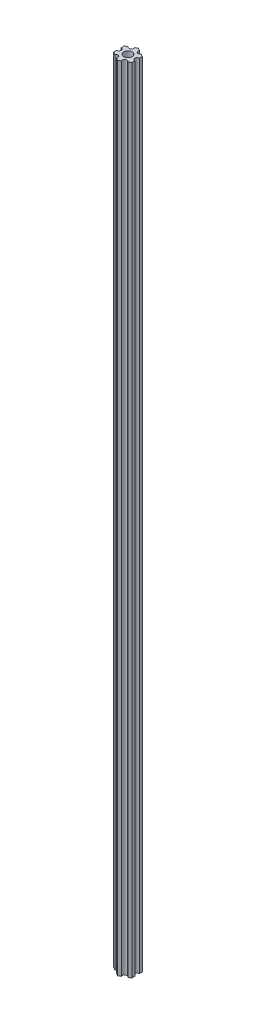
ISO-10303-21;
HEADER;
FILE_DESCRIPTION(('STEP AP214'),'2;1');
FILE_NAME('part.step','',(''),(''),'','','');
FILE_SCHEMA(('AUTOMOTIVE_DESIGN { 1 0 10303 214 1 1 1 1 }'));
ENDSEC;
DATA;
#1=APPLICATION_CONTEXT('core data for automotive mechanical design processes');
#2=APPLICATION_PROTOCOL_DEFINITION('international standard','automotive_design',2000,#1);
#3=PRODUCT_CONTEXT('',#1,'mechanical');
#4=PRODUCT('Part','Part','',(#3));
#5=PRODUCT_RELATED_PRODUCT_CATEGORY('part','',(#4));
#6=PRODUCT_DEFINITION_FORMATION('','',#4);
#7=PRODUCT_DEFINITION_CONTEXT('part definition',#1,'design');
#8=PRODUCT_DEFINITION('design','',#6,#7);
#9=PRODUCT_DEFINITION_SHAPE('','',#8);
#10=(LENGTH_UNIT() NAMED_UNIT(*) SI_UNIT(.MILLI.,.METRE.));
#11=(NAMED_UNIT(*) PLANE_ANGLE_UNIT() SI_UNIT($,.RADIAN.));
#12=(NAMED_UNIT(*) SI_UNIT($,.STERADIAN.) SOLID_ANGLE_UNIT());
#13=UNCERTAINTY_MEASURE_WITH_UNIT(LENGTH_MEASURE(1.E-05),#10,'distance_accuracy_value','');
#14=(GEOMETRIC_REPRESENTATION_CONTEXT(3) GLOBAL_UNCERTAINTY_ASSIGNED_CONTEXT((#13)) GLOBAL_UNIT_ASSIGNED_CONTEXT((#10,
#11,#12)) REPRESENTATION_CONTEXT('',''));
#15=CARTESIAN_POINT('',(0.,0.,0.));
#16=DIRECTION('',(0.,0.,1.));
#17=DIRECTION('',(1.,0.,0.));
#18=AXIS2_PLACEMENT_3D('',#15,#16,#17);
#19=CARTESIAN_POINT('',(3.175,-555.625,5.49926131403119));
#20=DIRECTION('',(0.,1.,0.));
#21=DIRECTION('',(-0.866025403784439,0.,0.5));
#22=AXIS2_PLACEMENT_3D('',#19,#20,#21);
#23=CYLINDRICAL_SURFACE('',#22,1.5875);
#24=DIRECTION('',(0.,-1.,0.));
#25=VECTOR('',#24,1.);
#26=CARTESIAN_POINT('',(1.8001846714922,-555.625,6.29301131403118));
#27=LINE('',#26,#25);
#28=CARTESIAN_POINT('',(1.8001846714922,0.,6.29301131403119));
#29=VERTEX_POINT('',#28);
#30=CARTESIAN_POINT('',(1.8001846714922,-555.625,6.29301131403119));
#31=VERTEX_POINT('',#30);
#32=EDGE_CURVE('E491',#29,#31,#27,.T.);
#33=ORIENTED_EDGE('',*,*,#32,.T.);
#34=CARTESIAN_POINT('',(3.175,-555.625,5.49926131403119));
#35=DIRECTION('',(0.,-1.,0.));
#36=DIRECTION('',(0.866025403784439,0.,-0.5));
#37=AXIS2_PLACEMENT_3D('',#34,#35,#36);
#38=CIRCLE('',#37,1.5875);
#39=CARTESIAN_POINT('',(4.5498153285078,-555.625,4.70551131403118));
#40=VERTEX_POINT('',#39);
#41=EDGE_CURVE('E307',#31,#40,#38,.T.);
#42=ORIENTED_EDGE('',*,*,#41,.T.);
#43=DIRECTION('',(0.,1.,0.));
#44=VECTOR('',#43,1.);
#45=CARTESIAN_POINT('',(4.5498153285078,-555.625,4.70551131403118));
#46=LINE('',#45,#44);
#47=CARTESIAN_POINT('',(4.5498153285078,0.,4.70551131403119));
#48=VERTEX_POINT('',#47);
#49=EDGE_CURVE('E349',#40,#48,#46,.T.);
#50=ORIENTED_EDGE('',*,*,#49,.T.);
#51=CARTESIAN_POINT('',(3.175,0.,5.49926131403119));
#52=DIRECTION('',(0.,-1.,0.));
#53=DIRECTION('',(0.866025403784439,0.,-0.5));
#54=AXIS2_PLACEMENT_3D('',#51,#52,#53);
#55=CIRCLE('',#54,1.5875);
#56=EDGE_CURVE('E318',#29,#48,#55,.T.);
#57=ORIENTED_EDGE('',*,*,#56,.F.);
#58=EDGE_LOOP('',(#33,#42,#50,#57));
#59=FACE_BOUND('',#58,.T.);
#60=ADVANCED_FACE('F17',(#59),#23,.F.);
#61=CARTESIAN_POINT('',(-3.175,-555.625,5.49926131403119));
#62=DIRECTION('',(0.,1.,0.));
#63=DIRECTION('',(-0.866025403784439,0.,-0.5));
#64=AXIS2_PLACEMENT_3D('',#61,#62,#63);
#65=CYLINDRICAL_SURFACE('',#64,1.5875);
#66=DIRECTION('',(0.,-1.,0.));
#67=VECTOR('',#66,1.);
#68=CARTESIAN_POINT('',(-4.5498153285078,-555.625,4.70551131403119));
#69=LINE('',#68,#67);
#70=CARTESIAN_POINT('',(-4.5498153285078,0.,4.70551131403119));
#71=VERTEX_POINT('',#70);
#72=CARTESIAN_POINT('',(-4.5498153285078,-555.625,4.70551131403119));
#73=VERTEX_POINT('',#72);
#74=EDGE_CURVE('E352',#71,#73,#69,.T.);
#75=ORIENTED_EDGE('',*,*,#74,.T.);
#76=CARTESIAN_POINT('',(-3.175,-555.625,5.49926131403119));
#77=DIRECTION('',(0.,-1.,0.));
#78=DIRECTION('',(0.866025403784439,0.,0.5));
#79=AXIS2_PLACEMENT_3D('',#76,#77,#78);
#80=CIRCLE('',#79,1.5875);
#81=CARTESIAN_POINT('',(-1.8001846714922,-555.625,6.29301131403119));
#82=VERTEX_POINT('',#81);
#83=EDGE_CURVE('E308',#73,#82,#80,.T.);
#84=ORIENTED_EDGE('',*,*,#83,.T.);
#85=DIRECTION('',(0.,1.,0.));
#86=VECTOR('',#85,1.);
#87=CARTESIAN_POINT('',(-1.8001846714922,-555.625,6.29301131403119));
#88=LINE('',#87,#86);
#89=CARTESIAN_POINT('',(-1.8001846714922,0.,6.29301131403119));
#90=VERTEX_POINT('',#89);
#91=EDGE_CURVE('E363',#82,#90,#88,.T.);
#92=ORIENTED_EDGE('',*,*,#91,.T.);
#93=CARTESIAN_POINT('',(-3.175,0.,5.49926131403119));
#94=DIRECTION('',(0.,-1.,0.));
#95=DIRECTION('',(0.866025403784439,0.,0.5));
#96=AXIS2_PLACEMENT_3D('',#93,#94,#95);
#97=CIRCLE('',#96,1.5875);
#98=EDGE_CURVE('E11',#71,#90,#97,.T.);
#99=ORIENTED_EDGE('',*,*,#98,.F.);
#100=EDGE_LOOP('',(#75,#84,#92,#99));
#101=FACE_BOUND('',#100,.T.);
#102=ADVANCED_FACE('F19',(#101),#65,.F.);
#103=CARTESIAN_POINT('',(-6.35,-555.625,0.));
#104=DIRECTION('',(0.,1.,0.));
#105=DIRECTION('',(0.,0.,-1.));
#106=AXIS2_PLACEMENT_3D('',#103,#104,#105);
#107=CYLINDRICAL_SURFACE('',#106,1.5875);
#108=DIRECTION('',(0.,-1.,0.));
#109=VECTOR('',#108,1.);
#110=CARTESIAN_POINT('',(-6.35,-555.625,-1.5875));
#111=LINE('',#110,#109);
#112=CARTESIAN_POINT('',(-6.35,0.,-1.5875));
#113=VERTEX_POINT('',#112);
#114=CARTESIAN_POINT('',(-6.35,-555.625,-1.5875));
#115=VERTEX_POINT('',#114);
#116=EDGE_CURVE('E375',#113,#115,#111,.T.);
#117=ORIENTED_EDGE('',*,*,#116,.T.);
#118=CARTESIAN_POINT('',(-6.35,-555.625,0.));
#119=DIRECTION('',(0.,-1.,0.));
#120=DIRECTION('',(0.,0.,1.));
#121=AXIS2_PLACEMENT_3D('',#118,#119,#120);
#122=CIRCLE('',#121,1.5875);
#123=CARTESIAN_POINT('',(-6.35,-555.625,1.5875));
#124=VERTEX_POINT('',#123);
#125=EDGE_CURVE('E216',#115,#124,#122,.T.);
#126=ORIENTED_EDGE('',*,*,#125,.T.);
#127=DIRECTION('',(0.,1.,0.));
#128=VECTOR('',#127,1.);
#129=CARTESIAN_POINT('',(-6.35,-555.625,1.5875));
#130=LINE('',#129,#128);
#131=CARTESIAN_POINT('',(-6.35,0.,1.5875));
#132=VERTEX_POINT('',#131);
#133=EDGE_CURVE('E207',#124,#132,#130,.T.);
#134=ORIENTED_EDGE('',*,*,#133,.T.);
#135=CARTESIAN_POINT('',(-6.35,0.,0.));
#136=DIRECTION('',(0.,-1.,0.));
#137=DIRECTION('',(0.,0.,1.));
#138=AXIS2_PLACEMENT_3D('',#135,#136,#137);
#139=CIRCLE('',#138,1.5875);
#140=EDGE_CURVE('E21',#113,#132,#139,.T.);
#141=ORIENTED_EDGE('',*,*,#140,.F.);
#142=EDGE_LOOP('',(#117,#126,#134,#141));
#143=FACE_BOUND('',#142,.T.);
#144=ADVANCED_FACE('F215',(#143),#107,.F.);
#145=CARTESIAN_POINT('',(-3.175,-555.625,-5.49926131403118));
#146=DIRECTION('',(0.,1.,0.));
#147=DIRECTION('',(0.866025403784439,0.,-0.5));
#148=AXIS2_PLACEMENT_3D('',#145,#146,#147);
#149=CYLINDRICAL_SURFACE('',#148,1.5875);
#150=DIRECTION('',(0.,-1.,0.));
#151=VECTOR('',#150,1.);
#152=CARTESIAN_POINT('',(-1.8001846714922,-555.625,-6.29301131403118));
#153=LINE('',#152,#151);
#154=CARTESIAN_POINT('',(-1.8001846714922,0.,-6.29301131403118));
#155=VERTEX_POINT('',#154);
#156=CARTESIAN_POINT('',(-1.8001846714922,-555.625,-6.29301131403118));
#157=VERTEX_POINT('',#156);
#158=EDGE_CURVE('E212',#155,#157,#153,.T.);
#159=ORIENTED_EDGE('',*,*,#158,.T.);
#160=CARTESIAN_POINT('',(-3.175,-555.625,-5.49926131403118));
#161=DIRECTION('',(0.,-1.,0.));
#162=DIRECTION('',(-0.866025403784439,0.,0.5));
#163=AXIS2_PLACEMENT_3D('',#160,#161,#162);
#164=CIRCLE('',#163,1.5875);
#165=CARTESIAN_POINT('',(-4.5498153285078,-555.625,-4.70551131403118));
#166=VERTEX_POINT('',#165);
#167=EDGE_CURVE('E288',#157,#166,#164,.T.);
#168=ORIENTED_EDGE('',*,*,#167,.T.);
#169=DIRECTION('',(0.,1.,0.));
#170=VECTOR('',#169,1.);
#171=CARTESIAN_POINT('',(-4.5498153285078,-555.625,-4.70551131403118));
#172=LINE('',#171,#170);
#173=CARTESIAN_POINT('',(-4.5498153285078,0.,-4.70551131403118));
#174=VERTEX_POINT('',#173);
#175=EDGE_CURVE('E257',#166,#174,#172,.T.);
#176=ORIENTED_EDGE('',*,*,#175,.T.);
#177=CARTESIAN_POINT('',(-3.175,0.,-5.49926131403118));
#178=DIRECTION('',(0.,-1.,0.));
#179=DIRECTION('',(-0.866025403784439,0.,0.5));
#180=AXIS2_PLACEMENT_3D('',#177,#178,#179);
#181=CIRCLE('',#180,1.5875);
#182=EDGE_CURVE('E203',#155,#174,#181,.T.);
#183=ORIENTED_EDGE('',*,*,#182,.F.);
#184=EDGE_LOOP('',(#159,#168,#176,#183));
#185=FACE_BOUND('',#184,.T.);
#186=ADVANCED_FACE('F332',(#185),#149,.F.);
#187=CARTESIAN_POINT('',(3.175,-555.625,-5.49926131403119));
#188=DIRECTION('',(0.,1.,0.));
#189=DIRECTION('',(0.866025403784439,0.,0.5));
#190=AXIS2_PLACEMENT_3D('',#187,#188,#189);
#191=CYLINDRICAL_SURFACE('',#190,1.5875);
#192=DIRECTION('',(0.,-1.,0.));
#193=VECTOR('',#192,1.);
#194=CARTESIAN_POINT('',(4.5498153285078,-555.625,-4.70551131403119));
#195=LINE('',#194,#193);
#196=CARTESIAN_POINT('',(4.5498153285078,0.,-4.70551131403119));
#197=VERTEX_POINT('',#196);
#198=CARTESIAN_POINT('',(4.5498153285078,-555.625,-4.70551131403119));
#199=VERTEX_POINT('',#198);
#200=EDGE_CURVE('E230',#197,#199,#195,.T.);
#201=ORIENTED_EDGE('',*,*,#200,.T.);
#202=CARTESIAN_POINT('',(3.175,-555.625,-5.49926131403119));
#203=DIRECTION('',(0.,-1.,0.));
#204=DIRECTION('',(-0.866025403784439,0.,-0.5));
#205=AXIS2_PLACEMENT_3D('',#202,#203,#204);
#206=CIRCLE('',#205,1.5875);
#207=CARTESIAN_POINT('',(1.8001846714922,-555.625,-6.29301131403119));
#208=VERTEX_POINT('',#207);
#209=EDGE_CURVE('E291',#199,#208,#206,.T.);
#210=ORIENTED_EDGE('',*,*,#209,.T.);
#211=DIRECTION('',(0.,1.,0.));
#212=VECTOR('',#211,1.);
#213=CARTESIAN_POINT('',(1.8001846714922,-555.625,-6.29301131403119));
#214=LINE('',#213,#212);
#215=CARTESIAN_POINT('',(1.8001846714922,0.,-6.29301131403119));
#216=VERTEX_POINT('',#215);
#217=EDGE_CURVE('E279',#208,#216,#214,.T.);
#218=ORIENTED_EDGE('',*,*,#217,.T.);
#219=CARTESIAN_POINT('',(3.175,0.,-5.49926131403119));
#220=DIRECTION('',(0.,-1.,0.));
#221=DIRECTION('',(-0.866025403784439,0.,-0.5));
#222=AXIS2_PLACEMENT_3D('',#219,#220,#221);
#223=CIRCLE('',#222,1.5875);
#224=EDGE_CURVE('E233',#197,#216,#223,.T.);
#225=ORIENTED_EDGE('',*,*,#224,.F.);
#226=EDGE_LOOP('',(#201,#210,#218,#225));
#227=FACE_BOUND('',#226,.T.);
#228=ADVANCED_FACE('F390',(#227),#191,.F.);
#229=CARTESIAN_POINT('',(6.35,-555.625,0.));
#230=DIRECTION('',(0.,1.,0.));
#231=DIRECTION('',(0.,0.,1.));
#232=AXIS2_PLACEMENT_3D('',#229,#230,#231);
#233=CYLINDRICAL_SURFACE('',#232,1.5875);
#234=DIRECTION('',(0.,-1.,0.));
#235=VECTOR('',#234,1.);
#236=CARTESIAN_POINT('',(6.35,-555.625,1.5875));
#237=LINE('',#236,#235);
#238=CARTESIAN_POINT('',(6.35,0.,1.5875));
#239=VERTEX_POINT('',#238);
#240=CARTESIAN_POINT('',(6.35,-555.625,1.5875));
#241=VERTEX_POINT('',#240);
#242=EDGE_CURVE('E295',#239,#241,#237,.T.);
#243=ORIENTED_EDGE('',*,*,#242,.T.);
#244=CARTESIAN_POINT('',(6.35,-555.625,0.));
#245=DIRECTION('',(0.,-1.,0.));
#246=DIRECTION('',(0.,0.,-1.));
#247=AXIS2_PLACEMENT_3D('',#244,#245,#246);
#248=CIRCLE('',#247,1.5875);
#249=CARTESIAN_POINT('',(6.35,-555.625,-1.5875));
#250=VERTEX_POINT('',#249);
#251=EDGE_CURVE('E313',#241,#250,#248,.T.);
#252=ORIENTED_EDGE('',*,*,#251,.T.);
#253=DIRECTION('',(0.,1.,0.));
#254=VECTOR('',#253,1.);
#255=CARTESIAN_POINT('',(6.35,-555.625,-1.5875));
#256=LINE('',#255,#254);
#257=CARTESIAN_POINT('',(6.35,0.,-1.5875));
#258=VERTEX_POINT('',#257);
#259=EDGE_CURVE('E248',#250,#258,#256,.T.);
#260=ORIENTED_EDGE('',*,*,#259,.T.);
#261=CARTESIAN_POINT('',(6.35,0.,0.));
#262=DIRECTION('',(0.,-1.,0.));
#263=DIRECTION('',(0.,0.,-1.));
#264=AXIS2_PLACEMENT_3D('',#261,#262,#263);
#265=CIRCLE('',#264,1.5875);
#266=EDGE_CURVE('E236',#239,#258,#265,.T.);
#267=ORIENTED_EDGE('',*,*,#266,.F.);
#268=EDGE_LOOP('',(#243,#252,#260,#267));
#269=FACE_BOUND('',#268,.T.);
#270=ADVANCED_FACE('F460',(#269),#233,.F.);
#271=CARTESIAN_POINT('',(0.,-555.625,0.));
#272=DIRECTION('',(0.,1.,0.));
#273=DIRECTION('',(0.,0.,1.));
#274=AXIS2_PLACEMENT_3D('',#271,#272,#273);
#275=CYLINDRICAL_SURFACE('',#274,2.9337);
#276=CARTESIAN_POINT('',(0.,0.,0.));
#277=DIRECTION('',(0.,-1.,0.));
#278=DIRECTION('',(0.,0.,-1.));
#279=AXIS2_PLACEMENT_3D('',#276,#277,#278);
#280=CIRCLE('',#279,2.9337);
#281=CARTESIAN_POINT('',(0.,0.,-2.9337));
#282=VERTEX_POINT('',#281);
#283=EDGE_CURVE('E37',#282,#282,#280,.T.);
#284=ORIENTED_EDGE('',*,*,#283,.F.);
#285=EDGE_LOOP('',(#284));
#286=FACE_BOUND('',#285,.T.);
#287=CARTESIAN_POINT('',(0.,-555.625,0.));
#288=DIRECTION('',(0.,-1.,0.));
#289=DIRECTION('',(0.,0.,-1.));
#290=AXIS2_PLACEMENT_3D('',#287,#288,#289);
#291=CIRCLE('',#290,2.9337);
#292=CARTESIAN_POINT('',(0.,-555.625,-2.9337));
#293=VERTEX_POINT('',#292);
#294=EDGE_CURVE('E44',#293,#293,#291,.T.);
#295=ORIENTED_EDGE('',*,*,#294,.T.);
#296=EDGE_LOOP('',(#295));
#297=FACE_BOUND('',#296,.T.);
#298=ADVANCED_FACE('F462',(#286,#297),#275,.F.);
#299=CARTESIAN_POINT('',(0.,0.,0.));
#300=DIRECTION('',(0.,-1.,0.));
#301=DIRECTION('',(0.,0.,-1.));
#302=AXIS2_PLACEMENT_3D('',#299,#300,#301);
#303=PLANE('',#302);
#304=DIRECTION('',(-0.866025403784439,0.,0.5));
#305=VECTOR('',#304,1.);
#306=CARTESIAN_POINT('',(3.175,0.,5.49926131403118));
#307=LINE('',#306,#305);
#308=CARTESIAN_POINT('',(0.,0.,7.33234841870825));
#309=VERTEX_POINT('',#308);
#310=EDGE_CURVE('E419',#29,#309,#307,.T.);
#311=ORIENTED_EDGE('',*,*,#310,.F.);
#312=ORIENTED_EDGE('',*,*,#56,.T.);
#313=DIRECTION('',(-0.866025403784439,0.,0.5));
#314=VECTOR('',#313,1.);
#315=CARTESIAN_POINT('',(3.175,0.,5.49926131403118));
#316=LINE('',#315,#314);
#317=CARTESIAN_POINT('',(6.35,0.,3.66617420935412));
#318=VERTEX_POINT('',#317);
#319=EDGE_CURVE('E356',#318,#48,#316,.T.);
#320=ORIENTED_EDGE('',*,*,#319,.F.);
#321=DIRECTION('',(0.,0.,1.));
#322=VECTOR('',#321,1.);
#323=CARTESIAN_POINT('',(6.35,0.,0.));
#324=LINE('',#323,#322);
#325=EDGE_CURVE('E249',#239,#318,#324,.T.);
#326=ORIENTED_EDGE('',*,*,#325,.F.);
#327=ORIENTED_EDGE('',*,*,#266,.T.);
#328=DIRECTION('',(0.,0.,1.));
#329=VECTOR('',#328,1.);
#330=CARTESIAN_POINT('',(6.35,0.,0.));
#331=LINE('',#330,#329);
#332=CARTESIAN_POINT('',(6.35,0.,-3.66617420935413));
#333=VERTEX_POINT('',#332);
#334=EDGE_CURVE('E304',#333,#258,#331,.T.);
#335=ORIENTED_EDGE('',*,*,#334,.F.);
#336=DIRECTION('',(0.866025403784439,0.,0.5));
#337=VECTOR('',#336,1.);
#338=CARTESIAN_POINT('',(3.175,0.,-5.49926131403119));
#339=LINE('',#338,#337);
#340=EDGE_CURVE('E270',#197,#333,#339,.T.);
#341=ORIENTED_EDGE('',*,*,#340,.F.);
#342=ORIENTED_EDGE('',*,*,#224,.T.);
#343=DIRECTION('',(0.866025403784439,0.,0.5));
#344=VECTOR('',#343,1.);
#345=CARTESIAN_POINT('',(3.175,0.,-5.49926131403119));
#346=LINE('',#345,#344);
#347=CARTESIAN_POINT('',(0.,0.,-7.33234841870825));
#348=VERTEX_POINT('',#347);
#349=EDGE_CURVE('E287',#348,#216,#346,.T.);
#350=ORIENTED_EDGE('',*,*,#349,.F.);
#351=DIRECTION('',(0.866025403784439,0.,-0.5));
#352=VECTOR('',#351,1.);
#353=CARTESIAN_POINT('',(-3.175,0.,-5.49926131403119));
#354=LINE('',#353,#352);
#355=EDGE_CURVE('E240',#155,#348,#354,.T.);
#356=ORIENTED_EDGE('',*,*,#355,.F.);
#357=ORIENTED_EDGE('',*,*,#182,.T.);
#358=DIRECTION('',(0.866025403784439,0.,-0.5));
#359=VECTOR('',#358,1.);
#360=CARTESIAN_POINT('',(-3.175,0.,-5.49926131403119));
#361=LINE('',#360,#359);
#362=CARTESIAN_POINT('',(-6.35,0.,-3.66617420935412));
#363=VERTEX_POINT('',#362);
#364=EDGE_CURVE('E262',#363,#174,#361,.T.);
#365=ORIENTED_EDGE('',*,*,#364,.F.);
#366=DIRECTION('',(0.,0.,-1.));
#367=VECTOR('',#366,1.);
#368=CARTESIAN_POINT('',(-6.35,0.,0.));
#369=LINE('',#368,#367);
#370=EDGE_CURVE('E197',#113,#363,#369,.T.);
#371=ORIENTED_EDGE('',*,*,#370,.F.);
#372=ORIENTED_EDGE('',*,*,#140,.T.);
#373=DIRECTION('',(0.,0.,-1.));
#374=VECTOR('',#373,1.);
#375=CARTESIAN_POINT('',(-6.35,0.,0.));
#376=LINE('',#375,#374);
#377=CARTESIAN_POINT('',(-6.35,0.,3.66617420935413));
#378=VERTEX_POINT('',#377);
#379=EDGE_CURVE('E194',#378,#132,#376,.T.);
#380=ORIENTED_EDGE('',*,*,#379,.F.);
#381=DIRECTION('',(-0.866025403784439,0.,-0.5));
#382=VECTOR('',#381,1.);
#383=CARTESIAN_POINT('',(-3.175,0.,5.49926131403119));
#384=LINE('',#383,#382);
#385=EDGE_CURVE('E355',#71,#378,#384,.T.);
#386=ORIENTED_EDGE('',*,*,#385,.F.);
#387=ORIENTED_EDGE('',*,*,#98,.T.);
#388=DIRECTION('',(-0.866025403784439,0.,-0.5));
#389=VECTOR('',#388,1.);
#390=CARTESIAN_POINT('',(-3.175,0.,5.49926131403119));
#391=LINE('',#390,#389);
#392=EDGE_CURVE('E362',#309,#90,#391,.T.);
#393=ORIENTED_EDGE('',*,*,#392,.F.);
#394=EDGE_LOOP('',(#311,#312,#320,#326,#327,#335,#341,#342,#350,#356,#357,#365,#371,#372,#380,
#386,#387,#393));
#395=FACE_BOUND('',#394,.T.);
#396=ORIENTED_EDGE('',*,*,#283,.T.);
#397=EDGE_LOOP('',(#396));
#398=FACE_BOUND('',#397,.T.);
#399=ADVANCED_FACE('F192',(#395,#398),#303,.F.);
#400=CARTESIAN_POINT('',(0.,-555.625,0.));
#401=DIRECTION('',(0.,-1.,0.));
#402=DIRECTION('',(0.,0.,-1.));
#403=AXIS2_PLACEMENT_3D('',#400,#401,#402);
#404=PLANE('',#403);
#405=ORIENTED_EDGE('',*,*,#41,.F.);
#406=DIRECTION('',(-0.866025403784439,0.,0.5));
#407=VECTOR('',#406,1.);
#408=CARTESIAN_POINT('',(3.175,-555.625,5.49926131403118));
#409=LINE('',#408,#407);
#410=CARTESIAN_POINT('',(0.,-555.625,7.33234841870825));
#411=VERTEX_POINT('',#410);
#412=EDGE_CURVE('E405',#31,#411,#409,.T.);
#413=ORIENTED_EDGE('',*,*,#412,.T.);
#414=DIRECTION('',(-0.866025403784439,0.,-0.5));
#415=VECTOR('',#414,1.);
#416=CARTESIAN_POINT('',(-3.175,-555.625,5.49926131403119));
#417=LINE('',#416,#415);
#418=EDGE_CURVE('E358',#411,#82,#417,.T.);
#419=ORIENTED_EDGE('',*,*,#418,.T.);
#420=ORIENTED_EDGE('',*,*,#83,.F.);
#421=DIRECTION('',(-0.866025403784439,0.,-0.5));
#422=VECTOR('',#421,1.);
#423=CARTESIAN_POINT('',(-3.175,-555.625,5.49926131403119));
#424=LINE('',#423,#422);
#425=CARTESIAN_POINT('',(-6.35,-555.625,3.66617420935413));
#426=VERTEX_POINT('',#425);
#427=EDGE_CURVE('E368',#73,#426,#424,.T.);
#428=ORIENTED_EDGE('',*,*,#427,.T.);
#429=DIRECTION('',(0.,0.,-1.));
#430=VECTOR('',#429,1.);
#431=CARTESIAN_POINT('',(-6.35,-555.625,0.));
#432=LINE('',#431,#430);
#433=EDGE_CURVE('E213',#426,#124,#432,.T.);
#434=ORIENTED_EDGE('',*,*,#433,.T.);
#435=ORIENTED_EDGE('',*,*,#125,.F.);
#436=DIRECTION('',(0.,0.,-1.));
#437=VECTOR('',#436,1.);
#438=CARTESIAN_POINT('',(-6.35,-555.625,0.));
#439=LINE('',#438,#437);
#440=CARTESIAN_POINT('',(-6.35,-555.625,-3.66617420935412));
#441=VERTEX_POINT('',#440);
#442=EDGE_CURVE('E219',#115,#441,#439,.T.);
#443=ORIENTED_EDGE('',*,*,#442,.T.);
#444=DIRECTION('',(0.866025403784439,0.,-0.5));
#445=VECTOR('',#444,1.);
#446=CARTESIAN_POINT('',(-3.175,-555.625,-5.49926131403119));
#447=LINE('',#446,#445);
#448=EDGE_CURVE('E261',#441,#166,#447,.T.);
#449=ORIENTED_EDGE('',*,*,#448,.T.);
#450=ORIENTED_EDGE('',*,*,#167,.F.);
#451=DIRECTION('',(0.866025403784439,0.,-0.5));
#452=VECTOR('',#451,1.);
#453=CARTESIAN_POINT('',(-3.175,-555.625,-5.49926131403119));
#454=LINE('',#453,#452);
#455=CARTESIAN_POINT('',(0.,-555.625,-7.33234841870825));
#456=VERTEX_POINT('',#455);
#457=EDGE_CURVE('E253',#157,#456,#454,.T.);
#458=ORIENTED_EDGE('',*,*,#457,.T.);
#459=DIRECTION('',(0.866025403784439,0.,0.5));
#460=VECTOR('',#459,1.);
#461=CARTESIAN_POINT('',(3.175,-555.625,-5.49926131403119));
#462=LINE('',#461,#460);
#463=EDGE_CURVE('E283',#456,#208,#462,.T.);
#464=ORIENTED_EDGE('',*,*,#463,.T.);
#465=ORIENTED_EDGE('',*,*,#209,.F.);
#466=DIRECTION('',(0.866025403784439,0.,0.5));
#467=VECTOR('',#466,1.);
#468=CARTESIAN_POINT('',(3.175,-555.625,-5.49926131403119));
#469=LINE('',#468,#467);
#470=CARTESIAN_POINT('',(6.35,-555.625,-3.66617420935413));
#471=VERTEX_POINT('',#470);
#472=EDGE_CURVE('E278',#199,#471,#469,.T.);
#473=ORIENTED_EDGE('',*,*,#472,.T.);
#474=DIRECTION('',(0.,0.,1.));
#475=VECTOR('',#474,1.);
#476=CARTESIAN_POINT('',(6.35,-555.625,0.));
#477=LINE('',#476,#475);
#478=EDGE_CURVE('E269',#471,#250,#477,.T.);
#479=ORIENTED_EDGE('',*,*,#478,.T.);
#480=ORIENTED_EDGE('',*,*,#251,.F.);
#481=DIRECTION('',(0.,0.,1.));
#482=VECTOR('',#481,1.);
#483=CARTESIAN_POINT('',(6.35,-555.625,0.));
#484=LINE('',#483,#482);
#485=CARTESIAN_POINT('',(6.35,-555.625,3.66617420935412));
#486=VERTEX_POINT('',#485);
#487=EDGE_CURVE('E245',#241,#486,#484,.T.);
#488=ORIENTED_EDGE('',*,*,#487,.T.);
#489=DIRECTION('',(-0.866025403784439,0.,0.5));
#490=VECTOR('',#489,1.);
#491=CARTESIAN_POINT('',(3.175,-555.625,5.49926131403118));
#492=LINE('',#491,#490);
#493=EDGE_CURVE('E345',#486,#40,#492,.T.);
#494=ORIENTED_EDGE('',*,*,#493,.T.);
#495=EDGE_LOOP('',(#405,#413,#419,#420,#428,#434,#435,#443,#449,#450,#458,#464,#465,#473,#479,
#480,#488,#494));
#496=FACE_BOUND('',#495,.T.);
#497=ORIENTED_EDGE('',*,*,#294,.F.);
#498=EDGE_LOOP('',(#497));
#499=FACE_BOUND('',#498,.T.);
#500=ADVANCED_FACE('F336',(#496,#499),#404,.T.);
#501=CARTESIAN_POINT('',(6.35,-555.625,0.));
#502=DIRECTION('',(-1.,0.,0.));
#503=DIRECTION('',(0.,1.,0.));
#504=AXIS2_PLACEMENT_3D('',#501,#502,#503);
#505=PLANE('',#504);
#506=ORIENTED_EDGE('',*,*,#259,.F.);
#507=ORIENTED_EDGE('',*,*,#478,.F.);
#508=DIRECTION('',(0.,1.,0.));
#509=VECTOR('',#508,1.);
#510=CARTESIAN_POINT('',(6.35,-555.625,-3.66617420935413));
#511=LINE('',#510,#509);
#512=EDGE_CURVE('E274',#471,#333,#511,.T.);
#513=ORIENTED_EDGE('',*,*,#512,.T.);
#514=ORIENTED_EDGE('',*,*,#334,.T.);
#515=EDGE_LOOP('',(#506,#507,#513,#514));
#516=FACE_BOUND('',#515,.T.);
#517=ADVANCED_FACE('F483',(#516),#505,.F.);
#518=CARTESIAN_POINT('',(6.35,-555.625,0.));
#519=DIRECTION('',(-1.,0.,0.));
#520=DIRECTION('',(0.,1.,0.));
#521=AXIS2_PLACEMENT_3D('',#518,#519,#520);
#522=PLANE('',#521);
#523=ORIENTED_EDGE('',*,*,#242,.F.);
#524=ORIENTED_EDGE('',*,*,#325,.T.);
#525=DIRECTION('',(0.,1.,0.));
#526=VECTOR('',#525,1.);
#527=CARTESIAN_POINT('',(6.35,-555.625,3.66617420935412));
#528=LINE('',#527,#526);
#529=EDGE_CURVE('E348',#486,#318,#528,.T.);
#530=ORIENTED_EDGE('',*,*,#529,.F.);
#531=ORIENTED_EDGE('',*,*,#487,.F.);
#532=EDGE_LOOP('',(#523,#524,#530,#531));
#533=FACE_BOUND('',#532,.T.);
#534=ADVANCED_FACE('F475',(#533),#522,.F.);
#535=CARTESIAN_POINT('',(3.175,-555.625,-5.49926131403119));
#536=DIRECTION('',(-0.5,0.,0.866025403784439));
#537=DIRECTION('',(0.,1.,0.));
#538=AXIS2_PLACEMENT_3D('',#535,#536,#537);
#539=PLANE('',#538);
#540=ORIENTED_EDGE('',*,*,#217,.F.);
#541=ORIENTED_EDGE('',*,*,#463,.F.);
#542=DIRECTION('',(0.,1.,0.));
#543=VECTOR('',#542,1.);
#544=CARTESIAN_POINT('',(0.,-555.625,-7.33234841870825));
#545=LINE('',#544,#543);
#546=EDGE_CURVE('E244',#456,#348,#545,.T.);
#547=ORIENTED_EDGE('',*,*,#546,.T.);
#548=ORIENTED_EDGE('',*,*,#349,.T.);
#549=EDGE_LOOP('',(#540,#541,#547,#548));
#550=FACE_BOUND('',#549,.T.);
#551=ADVANCED_FACE('F498',(#550),#539,.F.);
#552=CARTESIAN_POINT('',(3.175,-555.625,-5.49926131403119));
#553=DIRECTION('',(-0.5,0.,0.866025403784439));
#554=DIRECTION('',(0.,1.,0.));
#555=AXIS2_PLACEMENT_3D('',#552,#553,#554);
#556=PLANE('',#555);
#557=ORIENTED_EDGE('',*,*,#200,.F.);
#558=ORIENTED_EDGE('',*,*,#340,.T.);
#559=ORIENTED_EDGE('',*,*,#512,.F.);
#560=ORIENTED_EDGE('',*,*,#472,.F.);
#561=EDGE_LOOP('',(#557,#558,#559,#560));
#562=FACE_BOUND('',#561,.T.);
#563=ADVANCED_FACE('F394',(#562),#556,.F.);
#564=CARTESIAN_POINT('',(-3.175,-555.625,-5.49926131403119));
#565=DIRECTION('',(0.5,0.,0.866025403784439));
#566=DIRECTION('',(0.,-1.,0.));
#567=AXIS2_PLACEMENT_3D('',#564,#565,#566);
#568=PLANE('',#567);
#569=ORIENTED_EDGE('',*,*,#175,.F.);
#570=ORIENTED_EDGE('',*,*,#448,.F.);
#571=DIRECTION('',(0.,1.,0.));
#572=VECTOR('',#571,1.);
#573=CARTESIAN_POINT('',(-6.35,-555.625,-3.66617420935412));
#574=LINE('',#573,#572);
#575=EDGE_CURVE('E227',#441,#363,#574,.T.);
#576=ORIENTED_EDGE('',*,*,#575,.T.);
#577=ORIENTED_EDGE('',*,*,#364,.T.);
#578=EDGE_LOOP('',(#569,#570,#576,#577));
#579=FACE_BOUND('',#578,.T.);
#580=ADVANCED_FACE('F330',(#579),#568,.F.);
#581=CARTESIAN_POINT('',(-3.175,-555.625,-5.49926131403119));
#582=DIRECTION('',(0.5,0.,0.866025403784439));
#583=DIRECTION('',(0.,-1.,0.));
#584=AXIS2_PLACEMENT_3D('',#581,#582,#583);
#585=PLANE('',#584);
#586=ORIENTED_EDGE('',*,*,#158,.F.);
#587=ORIENTED_EDGE('',*,*,#355,.T.);
#588=ORIENTED_EDGE('',*,*,#546,.F.);
#589=ORIENTED_EDGE('',*,*,#457,.F.);
#590=EDGE_LOOP('',(#586,#587,#588,#589));
#591=FACE_BOUND('',#590,.T.);
#592=ADVANCED_FACE('F501',(#591),#585,.F.);
#593=CARTESIAN_POINT('',(-6.35,-555.625,0.));
#594=DIRECTION('',(1.,0.,0.));
#595=DIRECTION('',(0.,1.,0.));
#596=AXIS2_PLACEMENT_3D('',#593,#594,#595);
#597=PLANE('',#596);
#598=ORIENTED_EDGE('',*,*,#133,.F.);
#599=ORIENTED_EDGE('',*,*,#433,.F.);
#600=DIRECTION('',(0.,1.,0.));
#601=VECTOR('',#600,1.);
#602=CARTESIAN_POINT('',(-6.35,-555.625,3.66617420935413));
#603=LINE('',#602,#601);
#604=EDGE_CURVE('E209',#426,#378,#603,.T.);
#605=ORIENTED_EDGE('',*,*,#604,.T.);
#606=ORIENTED_EDGE('',*,*,#379,.T.);
#607=EDGE_LOOP('',(#598,#599,#605,#606));
#608=FACE_BOUND('',#607,.T.);
#609=ADVANCED_FACE('F206',(#608),#597,.F.);
#610=CARTESIAN_POINT('',(-6.35,-555.625,0.));
#611=DIRECTION('',(1.,0.,0.));
#612=DIRECTION('',(0.,1.,0.));
#613=AXIS2_PLACEMENT_3D('',#610,#611,#612);
#614=PLANE('',#613);
#615=ORIENTED_EDGE('',*,*,#116,.F.);
#616=ORIENTED_EDGE('',*,*,#370,.T.);
#617=ORIENTED_EDGE('',*,*,#575,.F.);
#618=ORIENTED_EDGE('',*,*,#442,.F.);
#619=EDGE_LOOP('',(#615,#616,#617,#618));
#620=FACE_BOUND('',#619,.T.);
#621=ADVANCED_FACE('F447',(#620),#614,.F.);
#622=CARTESIAN_POINT('',(-3.175,-555.625,5.49926131403119));
#623=DIRECTION('',(0.5,0.,-0.866025403784439));
#624=DIRECTION('',(0.,-1.,0.));
#625=AXIS2_PLACEMENT_3D('',#622,#623,#624);
#626=PLANE('',#625);
#627=ORIENTED_EDGE('',*,*,#91,.F.);
#628=ORIENTED_EDGE('',*,*,#418,.F.);
#629=DIRECTION('',(0.,1.,0.));
#630=VECTOR('',#629,1.);
#631=CARTESIAN_POINT('',(0.,-555.625,7.33234841870825));
#632=LINE('',#631,#630);
#633=EDGE_CURVE('E411',#411,#309,#632,.T.);
#634=ORIENTED_EDGE('',*,*,#633,.T.);
#635=ORIENTED_EDGE('',*,*,#392,.T.);
#636=EDGE_LOOP('',(#627,#628,#634,#635));
#637=FACE_BOUND('',#636,.T.);
#638=ADVANCED_FACE('F429',(#637),#626,.F.);
#639=CARTESIAN_POINT('',(-3.175,-555.625,5.49926131403119));
#640=DIRECTION('',(0.5,0.,-0.866025403784439));
#641=DIRECTION('',(0.,-1.,0.));
#642=AXIS2_PLACEMENT_3D('',#639,#640,#641);
#643=PLANE('',#642);
#644=ORIENTED_EDGE('',*,*,#74,.F.);
#645=ORIENTED_EDGE('',*,*,#385,.T.);
#646=ORIENTED_EDGE('',*,*,#604,.F.);
#647=ORIENTED_EDGE('',*,*,#427,.F.);
#648=EDGE_LOOP('',(#644,#645,#646,#647));
#649=FACE_BOUND('',#648,.T.);
#650=ADVANCED_FACE('F435',(#649),#643,.F.);
#651=CARTESIAN_POINT('',(3.175,-555.625,5.49926131403118));
#652=DIRECTION('',(-0.5,0.,-0.866025403784439));
#653=DIRECTION('',(-0.866025403784439,0.,0.5));
#654=AXIS2_PLACEMENT_3D('',#651,#652,#653);
#655=PLANE('',#654);
#656=ORIENTED_EDGE('',*,*,#49,.F.);
#657=ORIENTED_EDGE('',*,*,#493,.F.);
#658=ORIENTED_EDGE('',*,*,#529,.T.);
#659=ORIENTED_EDGE('',*,*,#319,.T.);
#660=EDGE_LOOP('',(#656,#657,#658,#659));
#661=FACE_BOUND('',#660,.T.);
#662=ADVANCED_FACE('F437',(#661),#655,.F.);
#663=CARTESIAN_POINT('',(3.175,-555.625,5.49926131403118));
#664=DIRECTION('',(-0.5,0.,-0.866025403784439));
#665=DIRECTION('',(-0.866025403784439,0.,0.5));
#666=AXIS2_PLACEMENT_3D('',#663,#664,#665);
#667=PLANE('',#666);
#668=ORIENTED_EDGE('',*,*,#32,.F.);
#669=ORIENTED_EDGE('',*,*,#310,.T.);
#670=ORIENTED_EDGE('',*,*,#633,.F.);
#671=ORIENTED_EDGE('',*,*,#412,.F.);
#672=EDGE_LOOP('',(#668,#669,#670,#671));
#673=FACE_BOUND('',#672,.T.);
#674=ADVANCED_FACE('F444',(#673),#667,.F.);
#675=CLOSED_SHELL('',(#60,#102,#144,#186,#228,#270,#298,#399,#500,#517,#534,#551,#563,#580,#592,
#609,#621,#638,#650,#662,#674));
#676=MANIFOLD_SOLID_BREP('B1',#675);
#677=ADVANCED_BREP_SHAPE_REPRESENTATION('',(#18,#676),#14);
#678=SHAPE_DEFINITION_REPRESENTATION(#9,#677);
ENDSEC;
END-ISO-10303-21;
